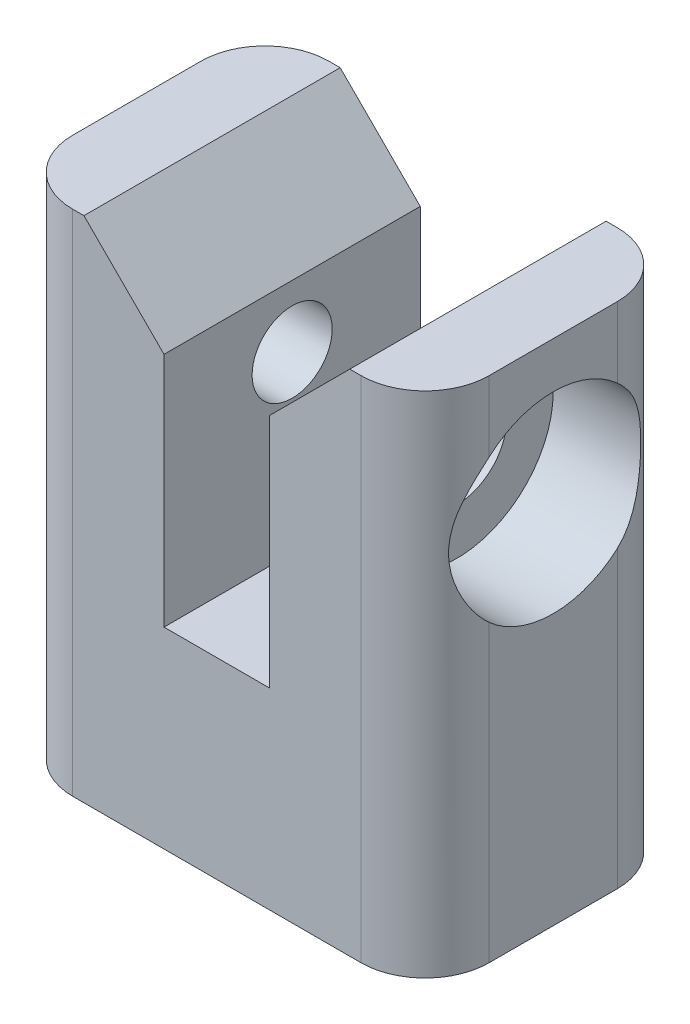
ISO-10303-21;
HEADER;
FILE_DESCRIPTION(('STEP AP214'),'2;1');
FILE_NAME('part.step','',(''),(''),'','','');
FILE_SCHEMA(('AUTOMOTIVE_DESIGN { 1 0 10303 214 1 1 1 1 }'));
ENDSEC;
DATA;
#1=APPLICATION_CONTEXT('core data for automotive mechanical design processes');
#2=APPLICATION_PROTOCOL_DEFINITION('international standard','automotive_design',2000,#1);
#3=PRODUCT_CONTEXT('',#1,'mechanical');
#4=PRODUCT('Part','Part','',(#3));
#5=PRODUCT_RELATED_PRODUCT_CATEGORY('part','',(#4));
#6=PRODUCT_DEFINITION_FORMATION('','',#4);
#7=PRODUCT_DEFINITION_CONTEXT('part definition',#1,'design');
#8=PRODUCT_DEFINITION('design','',#6,#7);
#9=PRODUCT_DEFINITION_SHAPE('','',#8);
#10=(LENGTH_UNIT() NAMED_UNIT(*) SI_UNIT(.MILLI.,.METRE.));
#11=(NAMED_UNIT(*) PLANE_ANGLE_UNIT() SI_UNIT($,.RADIAN.));
#12=(NAMED_UNIT(*) SI_UNIT($,.STERADIAN.) SOLID_ANGLE_UNIT());
#13=UNCERTAINTY_MEASURE_WITH_UNIT(LENGTH_MEASURE(1.E-05),#10,'distance_accuracy_value','');
#14=(GEOMETRIC_REPRESENTATION_CONTEXT(3) GLOBAL_UNCERTAINTY_ASSIGNED_CONTEXT((#13)) GLOBAL_UNIT_ASSIGNED_CONTEXT((#10,
#11,#12)) REPRESENTATION_CONTEXT('',''));
#15=CARTESIAN_POINT('',(0.,0.,0.));
#16=DIRECTION('',(0.,0.,1.));
#17=DIRECTION('',(1.,0.,0.));
#18=AXIS2_PLACEMENT_3D('',#15,#16,#17);
#19=CARTESIAN_POINT('',(6.5,0.,4.));
#20=DIRECTION('',(-1.,0.,0.));
#21=DIRECTION('',(0.,-1.,0.));
#22=AXIS2_PLACEMENT_3D('',#19,#20,#21);
#23=PLANE('',#22);
#24=DIRECTION('',(0.,0.,-1.));
#25=VECTOR('',#24,1.);
#26=CARTESIAN_POINT('',(6.5,15.875,4.));
#27=LINE('',#26,#25);
#28=CARTESIAN_POINT('',(6.5,15.875,2.));
#29=VERTEX_POINT('',#28);
#30=CARTESIAN_POINT('',(6.5,15.875,-2.));
#31=VERTEX_POINT('',#30);
#32=EDGE_CURVE('E240',#29,#31,#27,.T.);
#33=ORIENTED_EDGE('',*,*,#32,.F.);
#34=DIRECTION('',(0.,1.,0.));
#35=VECTOR('',#34,1.);
#36=CARTESIAN_POINT('',(6.5,0.,2.));
#37=LINE('',#36,#35);
#38=CARTESIAN_POINT('',(6.5,13.6735679774998,2.));
#39=VERTEX_POINT('',#38);
#40=EDGE_CURVE('E296',#29,#39,#37,.F.);
#41=ORIENTED_EDGE('',*,*,#40,.T.);
#42=CARTESIAN_POINT('',(6.5,11.4375,0.));
#43=DIRECTION('',(1.,0.,0.));
#44=DIRECTION('',(0.,0.,-1.));
#45=AXIS2_PLACEMENT_3D('',#42,#43,#44);
#46=CIRCLE('',#45,3.);
#47=CARTESIAN_POINT('',(6.5,13.6735679774998,-2.));
#48=VERTEX_POINT('',#47);
#49=EDGE_CURVE('E175',#48,#39,#46,.T.);
#50=ORIENTED_EDGE('',*,*,#49,.F.);
#51=DIRECTION('',(0.,1.,0.));
#52=VECTOR('',#51,1.);
#53=CARTESIAN_POINT('',(6.5,0.,-2.));
#54=LINE('',#53,#52);
#55=EDGE_CURVE('E290',#48,#31,#54,.T.);
#56=ORIENTED_EDGE('',*,*,#55,.T.);
#57=EDGE_LOOP('',(#33,#41,#50,#56));
#58=FACE_BOUND('',#57,.T.);
#59=ADVANCED_FACE('F45',(#58),#23,.F.);
#60=CARTESIAN_POINT('',(1.65,15.875,4.));
#61=DIRECTION('',(1.,0.,0.));
#62=DIRECTION('',(0.,0.,-1.));
#63=AXIS2_PLACEMENT_3D('',#60,#61,#62);
#64=PLANE('',#63);
#65=DIRECTION('',(0.,-1.,0.));
#66=VECTOR('',#65,1.);
#67=CARTESIAN_POINT('',(1.65,15.875,4.));
#68=LINE('',#67,#66);
#69=CARTESIAN_POINT('',(1.65,13.375,4.));
#70=VERTEX_POINT('',#69);
#71=CARTESIAN_POINT('',(1.65,6.,4.));
#72=VERTEX_POINT('',#71);
#73=EDGE_CURVE('E198',#70,#72,#68,.T.);
#74=ORIENTED_EDGE('',*,*,#73,.F.);
#75=DIRECTION('',(0.,0.,-1.));
#76=VECTOR('',#75,1.);
#77=CARTESIAN_POINT('',(1.65,13.375,4.));
#78=LINE('',#77,#76);
#79=CARTESIAN_POINT('',(1.65,13.375,-4.));
#80=VERTEX_POINT('',#79);
#81=EDGE_CURVE('E257',#70,#80,#78,.T.);
#82=ORIENTED_EDGE('',*,*,#81,.T.);
#83=DIRECTION('',(0.,-1.,0.));
#84=VECTOR('',#83,1.);
#85=CARTESIAN_POINT('',(1.65,15.875,-4.));
#86=LINE('',#85,#84);
#87=CARTESIAN_POINT('',(1.65,6.,-4.));
#88=VERTEX_POINT('',#87);
#89=EDGE_CURVE('E214',#80,#88,#86,.T.);
#90=ORIENTED_EDGE('',*,*,#89,.T.);
#91=DIRECTION('',(0.,0.,-1.));
#92=VECTOR('',#91,1.);
#93=CARTESIAN_POINT('',(1.65,6.,4.));
#94=LINE('',#93,#92);
#95=EDGE_CURVE('E237',#72,#88,#94,.T.);
#96=ORIENTED_EDGE('',*,*,#95,.F.);
#97=EDGE_LOOP('',(#74,#82,#90,#96));
#98=FACE_BOUND('',#97,.T.);
#99=CARTESIAN_POINT('',(1.65,11.4375,0.));
#100=DIRECTION('',(1.,0.,0.));
#101=DIRECTION('',(0.,0.,-1.));
#102=AXIS2_PLACEMENT_3D('',#99,#100,#101);
#103=CIRCLE('',#102,1.55);
#104=CARTESIAN_POINT('',(1.65,11.4375,-1.55));
#105=VERTEX_POINT('',#104);
#106=EDGE_CURVE('E180',#105,#105,#103,.F.);
#107=ORIENTED_EDGE('',*,*,#106,.F.);
#108=EDGE_LOOP('',(#107));
#109=FACE_BOUND('',#108,.T.);
#110=ADVANCED_FACE('F356',(#98,#109),#64,.F.);
#111=CARTESIAN_POINT('',(6.5,9.20143202250022,2.));
#112=VERTEX_POINT('',#111);
#113=CARTESIAN_POINT('',(6.5,9.20143202250022,-2.));
#114=VERTEX_POINT('',#113);
#115=EDGE_CURVE('E172',#112,#114,#46,.T.);
#116=ORIENTED_EDGE('',*,*,#115,.F.);
#117=DIRECTION('',(0.,1.,0.));
#118=VECTOR('',#117,1.);
#119=CARTESIAN_POINT('',(6.5,0.,2.));
#120=LINE('',#119,#118);
#121=CARTESIAN_POINT('',(6.5,0.,2.));
#122=VERTEX_POINT('',#121);
#123=EDGE_CURVE('E294',#112,#122,#120,.F.);
#124=ORIENTED_EDGE('',*,*,#123,.T.);
#125=DIRECTION('',(0.,0.,-1.));
#126=VECTOR('',#125,1.);
#127=CARTESIAN_POINT('',(6.5,0.,4.));
#128=LINE('',#127,#126);
#129=CARTESIAN_POINT('',(6.5,0.,-2.));
#130=VERTEX_POINT('',#129);
#131=EDGE_CURVE('E212',#122,#130,#128,.T.);
#132=ORIENTED_EDGE('',*,*,#131,.T.);
#133=DIRECTION('',(0.,1.,0.));
#134=VECTOR('',#133,1.);
#135=CARTESIAN_POINT('',(6.5,0.,-2.));
#136=LINE('',#135,#134);
#137=EDGE_CURVE('E292',#130,#114,#136,.T.);
#138=ORIENTED_EDGE('',*,*,#137,.T.);
#139=EDGE_LOOP('',(#116,#124,#132,#138));
#140=FACE_BOUND('',#139,.T.);
#141=ADVANCED_FACE('F359',(#140),#23,.F.);
#142=CARTESIAN_POINT('',(6.5,15.875,4.));
#143=DIRECTION('',(0.,-1.,0.));
#144=DIRECTION('',(0.,0.,-1.));
#145=AXIS2_PLACEMENT_3D('',#142,#143,#144);
#146=PLANE('',#145);
#147=DIRECTION('',(-1.,0.,0.));
#148=VECTOR('',#147,1.);
#149=CARTESIAN_POINT('',(6.5,15.875,4.));
#150=LINE('',#149,#148);
#151=CARTESIAN_POINT('',(4.5,15.875,4.));
#152=VERTEX_POINT('',#151);
#153=CARTESIAN_POINT('',(4.15000000000001,15.875,4.));
#154=VERTEX_POINT('',#153);
#155=EDGE_CURVE('E196',#152,#154,#150,.T.);
#156=ORIENTED_EDGE('',*,*,#155,.F.);
#157=CARTESIAN_POINT('',(4.5,15.875,2.));
#158=DIRECTION('',(0.,-1.,0.));
#159=DIRECTION('',(0.,0.,-1.));
#160=AXIS2_PLACEMENT_3D('',#157,#158,#159);
#161=CIRCLE('',#160,2.);
#162=EDGE_CURVE('E288',#152,#29,#161,.F.);
#163=ORIENTED_EDGE('',*,*,#162,.T.);
#164=ORIENTED_EDGE('',*,*,#32,.T.);
#165=CARTESIAN_POINT('',(4.5,15.875,-2.));
#166=DIRECTION('',(0.,-1.,0.));
#167=DIRECTION('',(0.,0.,-1.));
#168=AXIS2_PLACEMENT_3D('',#165,#166,#167);
#169=CIRCLE('',#168,2.);
#170=CARTESIAN_POINT('',(4.5,15.875,-4.));
#171=VERTEX_POINT('',#170);
#172=EDGE_CURVE('E286',#31,#171,#169,.F.);
#173=ORIENTED_EDGE('',*,*,#172,.T.);
#174=DIRECTION('',(-1.,0.,0.));
#175=VECTOR('',#174,1.);
#176=CARTESIAN_POINT('',(6.5,15.875,-4.));
#177=LINE('',#176,#175);
#178=CARTESIAN_POINT('',(4.15000000000001,15.875,-4.));
#179=VERTEX_POINT('',#178);
#180=EDGE_CURVE('E195',#171,#179,#177,.T.);
#181=ORIENTED_EDGE('',*,*,#180,.T.);
#182=DIRECTION('',(0.,0.,1.));
#183=VECTOR('',#182,1.);
#184=CARTESIAN_POINT('',(4.15000000000001,15.875,4.));
#185=LINE('',#184,#183);
#186=EDGE_CURVE('E260',#179,#154,#185,.T.);
#187=ORIENTED_EDGE('',*,*,#186,.T.);
#188=EDGE_LOOP('',(#156,#163,#164,#173,#181,#187));
#189=FACE_BOUND('',#188,.T.);
#190=ADVANCED_FACE('F354',(#189),#146,.F.);
#191=CARTESIAN_POINT('',(1.65,6.,4.));
#192=DIRECTION('',(0.,-1.,0.));
#193=DIRECTION('',(0.,0.,-1.));
#194=AXIS2_PLACEMENT_3D('',#191,#192,#193);
#195=PLANE('',#194);
#196=DIRECTION('',(-1.,0.,0.));
#197=VECTOR('',#196,1.);
#198=CARTESIAN_POINT('',(1.65,6.,-4.));
#199=LINE('',#198,#197);
#200=CARTESIAN_POINT('',(-1.65,6.,-4.));
#201=VERTEX_POINT('',#200);
#202=EDGE_CURVE('E216',#88,#201,#199,.T.);
#203=ORIENTED_EDGE('',*,*,#202,.T.);
#204=DIRECTION('',(0.,0.,-1.));
#205=VECTOR('',#204,1.);
#206=CARTESIAN_POINT('',(-1.65,6.,4.));
#207=LINE('',#206,#205);
#208=CARTESIAN_POINT('',(-1.65,6.,4.));
#209=VERTEX_POINT('',#208);
#210=EDGE_CURVE('E234',#209,#201,#207,.T.);
#211=ORIENTED_EDGE('',*,*,#210,.F.);
#212=DIRECTION('',(-1.,0.,0.));
#213=VECTOR('',#212,1.);
#214=CARTESIAN_POINT('',(1.65,6.,4.));
#215=LINE('',#214,#213);
#216=EDGE_CURVE('E201',#72,#209,#215,.T.);
#217=ORIENTED_EDGE('',*,*,#216,.F.);
#218=ORIENTED_EDGE('',*,*,#95,.T.);
#219=EDGE_LOOP('',(#203,#211,#217,#218));
#220=FACE_BOUND('',#219,.T.);
#221=ADVANCED_FACE('F350',(#220),#195,.F.);
#222=CARTESIAN_POINT('',(-1.65,6.,4.));
#223=DIRECTION('',(-1.,0.,0.));
#224=DIRECTION('',(0.,0.,1.));
#225=AXIS2_PLACEMENT_3D('',#222,#223,#224);
#226=PLANE('',#225);
#227=CARTESIAN_POINT('',(-1.65,11.4375,0.));
#228=DIRECTION('',(-1.,0.,0.));
#229=DIRECTION('',(0.,0.,1.));
#230=AXIS2_PLACEMENT_3D('',#227,#228,#229);
#231=CIRCLE('',#230,1.25);
#232=CARTESIAN_POINT('',(-1.65,11.4375,1.25));
#233=VERTEX_POINT('',#232);
#234=EDGE_CURVE('E192',#233,#233,#231,.T.);
#235=ORIENTED_EDGE('',*,*,#234,.T.);
#236=EDGE_LOOP('',(#235));
#237=FACE_BOUND('',#236,.T.);
#238=DIRECTION('',(0.,1.,0.));
#239=VECTOR('',#238,1.);
#240=CARTESIAN_POINT('',(-1.65,6.,-4.));
#241=LINE('',#240,#239);
#242=CARTESIAN_POINT('',(-1.65,13.375,-4.));
#243=VERTEX_POINT('',#242);
#244=EDGE_CURVE('E218',#201,#243,#241,.T.);
#245=ORIENTED_EDGE('',*,*,#244,.T.);
#246=DIRECTION('',(0.,0.,1.));
#247=VECTOR('',#246,1.);
#248=CARTESIAN_POINT('',(-1.65,13.375,4.));
#249=LINE('',#248,#247);
#250=CARTESIAN_POINT('',(-1.65,13.375,4.));
#251=VERTEX_POINT('',#250);
#252=EDGE_CURVE('E251',#243,#251,#249,.T.);
#253=ORIENTED_EDGE('',*,*,#252,.T.);
#254=DIRECTION('',(0.,1.,0.));
#255=VECTOR('',#254,1.);
#256=CARTESIAN_POINT('',(-1.65,6.,4.));
#257=LINE('',#256,#255);
#258=EDGE_CURVE('E203',#209,#251,#257,.T.);
#259=ORIENTED_EDGE('',*,*,#258,.F.);
#260=ORIENTED_EDGE('',*,*,#210,.T.);
#261=EDGE_LOOP('',(#245,#253,#259,#260));
#262=FACE_BOUND('',#261,.T.);
#263=ADVANCED_FACE('F346',(#237,#262),#226,.F.);
#264=CARTESIAN_POINT('',(-1.65,15.875,4.));
#265=DIRECTION('',(0.,-1.,0.));
#266=DIRECTION('',(0.,0.,-1.));
#267=AXIS2_PLACEMENT_3D('',#264,#265,#266);
#268=PLANE('',#267);
#269=DIRECTION('',(0.,0.,-1.));
#270=VECTOR('',#269,1.);
#271=CARTESIAN_POINT('',(-6.5,15.875,4.));
#272=LINE('',#271,#270);
#273=CARTESIAN_POINT('',(-6.5,15.875,2.));
#274=VERTEX_POINT('',#273);
#275=CARTESIAN_POINT('',(-6.5,15.875,-2.));
#276=VERTEX_POINT('',#275);
#277=EDGE_CURVE('E231',#274,#276,#272,.T.);
#278=ORIENTED_EDGE('',*,*,#277,.F.);
#279=CARTESIAN_POINT('',(-4.5,15.875,2.));
#280=DIRECTION('',(0.,-1.,0.));
#281=DIRECTION('',(0.,0.,-1.));
#282=AXIS2_PLACEMENT_3D('',#279,#280,#281);
#283=CIRCLE('',#282,2.);
#284=CARTESIAN_POINT('',(-4.5,15.875,4.));
#285=VERTEX_POINT('',#284);
#286=EDGE_CURVE('E284',#274,#285,#283,.F.);
#287=ORIENTED_EDGE('',*,*,#286,.T.);
#288=DIRECTION('',(-1.,0.,0.));
#289=VECTOR('',#288,1.);
#290=CARTESIAN_POINT('',(-1.65,15.875,4.));
#291=LINE('',#290,#289);
#292=CARTESIAN_POINT('',(-4.15,15.875,4.));
#293=VERTEX_POINT('',#292);
#294=EDGE_CURVE('E206',#293,#285,#291,.T.);
#295=ORIENTED_EDGE('',*,*,#294,.F.);
#296=DIRECTION('',(0.,0.,-1.));
#297=VECTOR('',#296,1.);
#298=CARTESIAN_POINT('',(-4.15,15.875,4.));
#299=LINE('',#298,#297);
#300=CARTESIAN_POINT('',(-4.15,15.875,-4.));
#301=VERTEX_POINT('',#300);
#302=EDGE_CURVE('E243',#293,#301,#299,.T.);
#303=ORIENTED_EDGE('',*,*,#302,.T.);
#304=DIRECTION('',(-1.,0.,0.));
#305=VECTOR('',#304,1.);
#306=CARTESIAN_POINT('',(-1.65,15.875,-4.));
#307=LINE('',#306,#305);
#308=CARTESIAN_POINT('',(-4.5,15.875,-4.));
#309=VERTEX_POINT('',#308);
#310=EDGE_CURVE('E221',#301,#309,#307,.T.);
#311=ORIENTED_EDGE('',*,*,#310,.T.);
#312=CARTESIAN_POINT('',(-4.5,15.875,-2.));
#313=DIRECTION('',(0.,-1.,0.));
#314=DIRECTION('',(0.,0.,-1.));
#315=AXIS2_PLACEMENT_3D('',#312,#313,#314);
#316=CIRCLE('',#315,2.);
#317=EDGE_CURVE('E282',#309,#276,#316,.F.);
#318=ORIENTED_EDGE('',*,*,#317,.T.);
#319=EDGE_LOOP('',(#278,#287,#295,#303,#311,#318));
#320=FACE_BOUND('',#319,.T.);
#321=ADVANCED_FACE('F342',(#320),#268,.F.);
#322=CARTESIAN_POINT('',(-6.5,15.875,4.));
#323=DIRECTION('',(1.,0.,0.));
#324=DIRECTION('',(0.,1.,0.));
#325=AXIS2_PLACEMENT_3D('',#322,#323,#324);
#326=PLANE('',#325);
#327=CARTESIAN_POINT('',(-6.5,11.4375,0.));
#328=DIRECTION('',(1.,0.,0.));
#329=DIRECTION('',(0.,0.,-1.));
#330=AXIS2_PLACEMENT_3D('',#327,#328,#329);
#331=CIRCLE('',#330,1.25);
#332=CARTESIAN_POINT('',(-6.5,11.4375,-1.25));
#333=VERTEX_POINT('',#332);
#334=EDGE_CURVE('E182',#333,#333,#331,.T.);
#335=ORIENTED_EDGE('',*,*,#334,.T.);
#336=EDGE_LOOP('',(#335));
#337=FACE_BOUND('',#336,.T.);
#338=DIRECTION('',(0.,0.,-1.));
#339=VECTOR('',#338,1.);
#340=CARTESIAN_POINT('',(-6.5,0.,4.));
#341=LINE('',#340,#339);
#342=CARTESIAN_POINT('',(-6.5,0.,2.));
#343=VERTEX_POINT('',#342);
#344=CARTESIAN_POINT('',(-6.5,0.,-2.));
#345=VERTEX_POINT('',#344);
#346=EDGE_CURVE('E228',#343,#345,#341,.T.);
#347=ORIENTED_EDGE('',*,*,#346,.F.);
#348=DIRECTION('',(0.,-1.,0.));
#349=VECTOR('',#348,1.);
#350=CARTESIAN_POINT('',(-6.5,15.875,2.));
#351=LINE('',#350,#349);
#352=EDGE_CURVE('E280',#343,#274,#351,.F.);
#353=ORIENTED_EDGE('',*,*,#352,.T.);
#354=ORIENTED_EDGE('',*,*,#277,.T.);
#355=DIRECTION('',(0.,-1.,0.));
#356=VECTOR('',#355,1.);
#357=CARTESIAN_POINT('',(-6.5,15.875,-2.));
#358=LINE('',#357,#356);
#359=EDGE_CURVE('E277',#276,#345,#358,.T.);
#360=ORIENTED_EDGE('',*,*,#359,.T.);
#361=EDGE_LOOP('',(#347,#353,#354,#360));
#362=FACE_BOUND('',#361,.T.);
#363=ADVANCED_FACE('F338',(#337,#362),#326,.F.);
#364=CARTESIAN_POINT('',(-6.5,0.,4.));
#365=DIRECTION('',(0.,1.,0.));
#366=DIRECTION('',(0.,0.,1.));
#367=AXIS2_PLACEMENT_3D('',#364,#365,#366);
#368=PLANE('',#367);
#369=CARTESIAN_POINT('',(0.,0.,0.));
#370=DIRECTION('',(0.,-1.,0.));
#371=DIRECTION('',(0.,0.,-1.));
#372=AXIS2_PLACEMENT_3D('',#369,#370,#371);
#373=CIRCLE('',#372,1.24999999999999);
#374=CARTESIAN_POINT('',(0.,0.,-1.24999999999999));
#375=VERTEX_POINT('',#374);
#376=EDGE_CURVE('E173',#375,#375,#373,.T.);
#377=ORIENTED_EDGE('',*,*,#376,.F.);
#378=EDGE_LOOP('',(#377));
#379=FACE_BOUND('',#378,.T.);
#380=DIRECTION('',(1.,0.,0.));
#381=VECTOR('',#380,1.);
#382=CARTESIAN_POINT('',(-6.5,0.,4.));
#383=LINE('',#382,#381);
#384=CARTESIAN_POINT('',(-4.5,0.,4.));
#385=VERTEX_POINT('',#384);
#386=CARTESIAN_POINT('',(4.5,0.,4.));
#387=VERTEX_POINT('',#386);
#388=EDGE_CURVE('E209',#385,#387,#383,.T.);
#389=ORIENTED_EDGE('',*,*,#388,.F.);
#390=CARTESIAN_POINT('',(-4.5,0.,2.));
#391=DIRECTION('',(0.,1.,0.));
#392=DIRECTION('',(0.,0.,1.));
#393=AXIS2_PLACEMENT_3D('',#390,#391,#392);
#394=CIRCLE('',#393,2.);
#395=EDGE_CURVE('E275',#385,#343,#394,.F.);
#396=ORIENTED_EDGE('',*,*,#395,.T.);
#397=ORIENTED_EDGE('',*,*,#346,.T.);
#398=CARTESIAN_POINT('',(-4.5,0.,-2.));
#399=DIRECTION('',(0.,1.,0.));
#400=DIRECTION('',(0.,0.,1.));
#401=AXIS2_PLACEMENT_3D('',#398,#399,#400);
#402=CIRCLE('',#401,2.);
#403=CARTESIAN_POINT('',(-4.5,0.,-4.));
#404=VERTEX_POINT('',#403);
#405=EDGE_CURVE('E271',#345,#404,#402,.F.);
#406=ORIENTED_EDGE('',*,*,#405,.T.);
#407=DIRECTION('',(1.,0.,0.));
#408=VECTOR('',#407,1.);
#409=CARTESIAN_POINT('',(-6.5,0.,-4.));
#410=LINE('',#409,#408);
#411=CARTESIAN_POINT('',(4.5,0.,-4.));
#412=VERTEX_POINT('',#411);
#413=EDGE_CURVE('E199',#404,#412,#410,.T.);
#414=ORIENTED_EDGE('',*,*,#413,.T.);
#415=CARTESIAN_POINT('',(4.5,0.,-2.));
#416=DIRECTION('',(0.,1.,0.));
#417=DIRECTION('',(0.,0.,1.));
#418=AXIS2_PLACEMENT_3D('',#415,#416,#417);
#419=CIRCLE('',#418,2.);
#420=EDGE_CURVE('E269',#412,#130,#419,.F.);
#421=ORIENTED_EDGE('',*,*,#420,.T.);
#422=ORIENTED_EDGE('',*,*,#131,.F.);
#423=CARTESIAN_POINT('',(4.5,0.,2.));
#424=DIRECTION('',(0.,1.,0.));
#425=DIRECTION('',(0.,0.,1.));
#426=AXIS2_PLACEMENT_3D('',#423,#424,#425);
#427=CIRCLE('',#426,2.);
#428=EDGE_CURVE('E273',#122,#387,#427,.F.);
#429=ORIENTED_EDGE('',*,*,#428,.T.);
#430=EDGE_LOOP('',(#389,#396,#397,#406,#414,#421,#422,#429));
#431=FACE_BOUND('',#430,.T.);
#432=ADVANCED_FACE('F331',(#379,#431),#368,.F.);
#433=CARTESIAN_POINT('',(0.,0.,4.));
#434=DIRECTION('',(0.,0.,1.));
#435=DIRECTION('',(1.,0.,0.));
#436=AXIS2_PLACEMENT_3D('',#433,#434,#435);
#437=PLANE('',#436);
#438=ORIENTED_EDGE('',*,*,#294,.T.);
#439=DIRECTION('',(0.,-1.,0.));
#440=VECTOR('',#439,1.);
#441=CARTESIAN_POINT('',(-4.5,0.,4.));
#442=LINE('',#441,#440);
#443=EDGE_CURVE('E266',#285,#385,#442,.T.);
#444=ORIENTED_EDGE('',*,*,#443,.T.);
#445=ORIENTED_EDGE('',*,*,#388,.T.);
#446=DIRECTION('',(0.,1.,0.));
#447=VECTOR('',#446,1.);
#448=CARTESIAN_POINT('',(4.5,15.875,4.));
#449=LINE('',#448,#447);
#450=EDGE_CURVE('E263',#387,#152,#449,.T.);
#451=ORIENTED_EDGE('',*,*,#450,.T.);
#452=ORIENTED_EDGE('',*,*,#155,.T.);
#453=DIRECTION('',(0.707106781186549,0.707106781186546,0.));
#454=VECTOR('',#453,1.);
#455=CARTESIAN_POINT('',(-5.86250000000001,5.86250000000004,4.));
#456=LINE('',#455,#454);
#457=EDGE_CURVE('E253',#154,#70,#456,.F.);
#458=ORIENTED_EDGE('',*,*,#457,.T.);
#459=ORIENTED_EDGE('',*,*,#73,.T.);
#460=ORIENTED_EDGE('',*,*,#216,.T.);
#461=ORIENTED_EDGE('',*,*,#258,.T.);
#462=DIRECTION('',(0.707106781186546,-0.707106781186549,0.));
#463=VECTOR('',#462,1.);
#464=CARTESIAN_POINT('',(5.86249999999999,5.86249999999997,4.));
#465=LINE('',#464,#463);
#466=EDGE_CURVE('E255',#251,#293,#465,.F.);
#467=ORIENTED_EDGE('',*,*,#466,.T.);
#468=EDGE_LOOP('',(#438,#444,#445,#451,#452,#458,#459,#460,#461,#467));
#469=FACE_BOUND('',#468,.T.);
#470=ADVANCED_FACE('F328',(#469),#437,.T.);
#471=CARTESIAN_POINT('',(0.,0.,-4.));
#472=DIRECTION('',(0.,0.,1.));
#473=DIRECTION('',(1.,0.,0.));
#474=AXIS2_PLACEMENT_3D('',#471,#472,#473);
#475=PLANE('',#474);
#476=ORIENTED_EDGE('',*,*,#413,.F.);
#477=DIRECTION('',(0.,-1.,0.));
#478=VECTOR('',#477,1.);
#479=CARTESIAN_POINT('',(-4.5,0.,-4.));
#480=LINE('',#479,#478);
#481=EDGE_CURVE('E11',#404,#309,#480,.F.);
#482=ORIENTED_EDGE('',*,*,#481,.T.);
#483=ORIENTED_EDGE('',*,*,#310,.F.);
#484=DIRECTION('',(-0.707106781186546,0.707106781186549,0.));
#485=VECTOR('',#484,1.);
#486=CARTESIAN_POINT('',(-4.15,15.875,-4.));
#487=LINE('',#486,#485);
#488=EDGE_CURVE('E249',#301,#243,#487,.F.);
#489=ORIENTED_EDGE('',*,*,#488,.T.);
#490=ORIENTED_EDGE('',*,*,#244,.F.);
#491=ORIENTED_EDGE('',*,*,#202,.F.);
#492=ORIENTED_EDGE('',*,*,#89,.F.);
#493=DIRECTION('',(-0.707106781186549,-0.707106781186546,0.));
#494=VECTOR('',#493,1.);
#495=CARTESIAN_POINT('',(1.65,13.375,-4.));
#496=LINE('',#495,#494);
#497=EDGE_CURVE('E246',#80,#179,#496,.F.);
#498=ORIENTED_EDGE('',*,*,#497,.T.);
#499=ORIENTED_EDGE('',*,*,#180,.F.);
#500=DIRECTION('',(0.,1.,0.));
#501=VECTOR('',#500,1.);
#502=CARTESIAN_POINT('',(4.5,0.,-4.));
#503=LINE('',#502,#501);
#504=EDGE_CURVE('E54',#171,#412,#503,.F.);
#505=ORIENTED_EDGE('',*,*,#504,.T.);
#506=EDGE_LOOP('',(#476,#482,#483,#489,#490,#491,#492,#498,#499,#505));
#507=FACE_BOUND('',#506,.T.);
#508=ADVANCED_FACE('F326',(#507),#475,.F.);
#509=CARTESIAN_POINT('',(6.5,11.4375,0.));
#510=DIRECTION('',(1.,0.,0.));
#511=DIRECTION('',(0.,0.,-1.));
#512=AXIS2_PLACEMENT_3D('',#509,#510,#511);
#513=CYLINDRICAL_SURFACE('',#512,1.25);
#514=ORIENTED_EDGE('',*,*,#334,.F.);
#515=EDGE_LOOP('',(#514));
#516=FACE_BOUND('',#515,.T.);
#517=ORIENTED_EDGE('',*,*,#234,.F.);
#518=EDGE_LOOP('',(#517));
#519=FACE_BOUND('',#518,.T.);
#520=ADVANCED_FACE('F322',(#516,#519),#513,.F.);
#521=CARTESIAN_POINT('',(6.5,11.4375,0.));
#522=DIRECTION('',(1.,0.,0.));
#523=DIRECTION('',(0.,0.,-1.));
#524=AXIS2_PLACEMENT_3D('',#521,#522,#523);
#525=CYLINDRICAL_SURFACE('',#524,1.55);
#526=ORIENTED_EDGE('',*,*,#106,.T.);
#527=EDGE_LOOP('',(#526));
#528=FACE_BOUND('',#527,.T.);
#529=CARTESIAN_POINT('',(3.5,11.4375,0.));
#530=DIRECTION('',(1.,0.,0.));
#531=DIRECTION('',(0.,0.,-1.));
#532=AXIS2_PLACEMENT_3D('',#529,#530,#531);
#533=CIRCLE('',#532,1.55);
#534=CARTESIAN_POINT('',(3.5,11.4375,-1.55));
#535=VERTEX_POINT('',#534);
#536=EDGE_CURVE('E183',#535,#535,#533,.T.);
#537=ORIENTED_EDGE('',*,*,#536,.T.);
#538=EDGE_LOOP('',(#537));
#539=FACE_BOUND('',#538,.T.);
#540=ADVANCED_FACE('F318',(#528,#539),#525,.F.);
#541=CARTESIAN_POINT('',(3.5,12.9875,0.));
#542=DIRECTION('',(-1.,0.,0.));
#543=DIRECTION('',(0.,0.,1.));
#544=AXIS2_PLACEMENT_3D('',#541,#542,#543);
#545=PLANE('',#544);
#546=ORIENTED_EDGE('',*,*,#536,.F.);
#547=EDGE_LOOP('',(#546));
#548=FACE_BOUND('',#547,.T.);
#549=CARTESIAN_POINT('',(3.5,11.4375,0.));
#550=DIRECTION('',(1.,0.,0.));
#551=DIRECTION('',(0.,0.,-1.));
#552=AXIS2_PLACEMENT_3D('',#549,#550,#551);
#553=CIRCLE('',#552,3.);
#554=CARTESIAN_POINT('',(3.5,11.4375,-3.));
#555=VERTEX_POINT('',#554);
#556=EDGE_CURVE('E185',#555,#555,#553,.T.);
#557=ORIENTED_EDGE('',*,*,#556,.T.);
#558=EDGE_LOOP('',(#557));
#559=FACE_BOUND('',#558,.T.);
#560=ADVANCED_FACE('F312',(#548,#559),#545,.F.);
#561=CARTESIAN_POINT('',(6.5,11.4375,0.));
#562=DIRECTION('',(1.,0.,0.));
#563=DIRECTION('',(0.,0.,-1.));
#564=AXIS2_PLACEMENT_3D('',#561,#562,#563);
#565=CYLINDRICAL_SURFACE('',#564,3.);
#566=ORIENTED_EDGE('',*,*,#556,.F.);
#567=EDGE_LOOP('',(#566));
#568=FACE_BOUND('',#567,.T.);
#569=ORIENTED_EDGE('',*,*,#49,.T.);
#570=CARTESIAN_POINT('',(6.5,13.6735679774998,2.));
#571=CARTESIAN_POINT('',(6.499991001011,13.6163855478033,2.06394517691885));
#572=CARTESIAN_POINT('',(6.4969360380857,13.5565364412217,2.12532528051229));
#573=CARTESIAN_POINT('',(6.48611898621429,13.4321447310036,2.24246904553587));
#574=CARTESIAN_POINT('',(6.47836508123115,13.3676104589545,2.298242275777));
#575=CARTESIAN_POINT('',(6.45017234272973,13.168096745179,2.45637007661865));
#576=CARTESIAN_POINT('',(6.42478284473025,13.0267936596859,2.54999094611882));
#577=CARTESIAN_POINT('',(6.37374363556637,12.7466499131143,2.70351409692412));
#578=CARTESIAN_POINT('',(6.34839702859367,12.6090884407773,2.76591417176496));
#579=CARTESIAN_POINT('',(6.30196858335304,12.3253388832018,2.86957685432165));
#580=CARTESIAN_POINT('',(6.28088654858421,12.1791511958391,2.91084043608888));
#581=CARTESIAN_POINT('',(6.25596949240038,11.9474243254817,2.95755558506507));
#582=CARTESIAN_POINT('',(6.248632542817,11.8637627857724,2.97077330715622));
#583=CARTESIAN_POINT('',(6.23776717812591,11.6953505861091,2.99009818067826));
#584=CARTESIAN_POINT('',(6.23423875917959,11.6105999272529,2.99620533927588));
#585=CARTESIAN_POINT('',(6.23136049723198,11.4408883025956,3.0011984244539));
#586=CARTESIAN_POINT('',(6.2320071885158,11.355927569728,3.00009034032449));
#587=CARTESIAN_POINT('',(6.23740229886055,11.1865417977142,2.99068785441197));
#588=CARTESIAN_POINT('',(6.24215049675273,11.1021167299303,2.9823938401213));
#589=CARTESIAN_POINT('',(6.25444574206346,10.9450915727392,2.96023799477242));
#590=CARTESIAN_POINT('',(6.26156617601762,10.8723385096925,2.94720665500375));
#591=CARTESIAN_POINT('',(6.27805254568629,10.7282237627781,2.91588199177903));
#592=CARTESIAN_POINT('',(6.28741918087212,10.6568625198259,2.89758702886555));
#593=CARTESIAN_POINT('',(6.31797183442906,10.445187514645,2.83495868687428));
#594=CARTESIAN_POINT('',(6.34159414686495,10.3074578758696,2.78290698794504));
#595=CARTESIAN_POINT('',(6.39191744429795,10.0269645681969,2.65268930185857));
#596=CARTESIAN_POINT('',(6.41867912533449,9.88521761274556,2.57233831358789));
#597=CARTESIAN_POINT('',(6.45266518339439,9.68339217182401,2.43509943111144));
#598=CARTESIAN_POINT('',(6.46295878825199,9.61799094310306,2.38663843700204));
#599=CARTESIAN_POINT('',(6.48036336932118,9.49111311300452,2.2843387371315));
#600=CARTESIAN_POINT('',(6.48747705373093,9.42963321041528,2.23050465538148));
#601=CARTESIAN_POINT('',(6.49483575714756,9.34109484225228,2.1463272041771));
#602=CARTESIAN_POINT('',(6.49673503153455,9.31235428526319,2.11787440473897));
#603=CARTESIAN_POINT('',(6.4993170113589,9.25601833199297,2.05979965940774));
#604=CARTESIAN_POINT('',(6.49999960377178,9.22842304233476,2.03017760515717));
#605=CARTESIAN_POINT('',(6.5,9.20143202250021,2.));
#606=B_SPLINE_CURVE_WITH_KNOTS('',3,(#570,#571,#572,#573,#574,#575,#576,#577,#578,#579,#580,
#581,#582,#583,#584,#585,#586,#587,#588,#589,#590,#591,#592,#593,#594,#595,#596,#597,#598,#599,
#600,#601,#602,#603,#604,#605),.UNSPECIFIED.,.F.,.F.,(4,2,2,2,2,2,2,2,2,2,2,2,2,2,2,2,2,4),(0.,
0.257003095036121,0.513559859167406,1.02485284203966,1.4828396357824,1.94080532182222,
2.19552218723163,2.45023879591204,2.70474399422835,2.95923546951888,3.18175175856396,
3.40433742978967,3.85003679324152,4.34303172260549,4.58891756679052,4.83459359999334,
4.95600984354938,5.07743736555963),.UNSPECIFIED.);
#607=EDGE_CURVE('E69',#39,#112,#606,.T.);
#608=ORIENTED_EDGE('',*,*,#607,.T.);
#609=ORIENTED_EDGE('',*,*,#115,.T.);
#610=CARTESIAN_POINT('',(6.5,9.20143202250022,-2.));
#611=CARTESIAN_POINT('',(6.499991001011,9.25861445219666,-2.06394517691885));
#612=CARTESIAN_POINT('',(6.4969360380857,9.31846355877826,-2.12532528051229));
#613=CARTESIAN_POINT('',(6.48611898621429,9.44285526899635,-2.24246904553587));
#614=CARTESIAN_POINT('',(6.47836508123115,9.50738954104551,-2.298242275777));
#615=CARTESIAN_POINT('',(6.45017234272973,9.70690325482101,-2.45637007661865));
#616=CARTESIAN_POINT('',(6.42478284473025,9.84820634031407,-2.54999094611882));
#617=CARTESIAN_POINT('',(6.37374363556637,10.1283500868857,-2.70351409692412));
#618=CARTESIAN_POINT('',(6.34839702859367,10.2659115592227,-2.76591417176496));
#619=CARTESIAN_POINT('',(6.30196858335304,10.5496611167982,-2.86957685432165));
#620=CARTESIAN_POINT('',(6.28088654858421,10.6958488041609,-2.91084043608888));
#621=CARTESIAN_POINT('',(6.25596949240038,10.9275756745183,-2.95755558506507));
#622=CARTESIAN_POINT('',(6.248632542817,11.0112372142276,-2.97077330715622));
#623=CARTESIAN_POINT('',(6.23776717812591,11.1796494138909,-2.99009818067826));
#624=CARTESIAN_POINT('',(6.23423875917959,11.2644000727471,-2.99620533927588));
#625=CARTESIAN_POINT('',(6.23136049723198,11.4341116974044,-3.0011984244539));
#626=CARTESIAN_POINT('',(6.2320071885158,11.519072430272,-3.00009034032449));
#627=CARTESIAN_POINT('',(6.23740229886055,11.6884582022858,-2.99068785441197));
#628=CARTESIAN_POINT('',(6.24215049675273,11.7728832700697,-2.9823938401213));
#629=CARTESIAN_POINT('',(6.25444574206346,11.9299084272608,-2.96023799477242));
#630=CARTESIAN_POINT('',(6.26156617601762,12.0026614903075,-2.94720665500375));
#631=CARTESIAN_POINT('',(6.27805254568629,12.1467762372219,-2.91588199177903));
#632=CARTESIAN_POINT('',(6.28741918087213,12.2181374801741,-2.89758702886555));
#633=CARTESIAN_POINT('',(6.31797183442906,12.429812485355,-2.83495868687428));
#634=CARTESIAN_POINT('',(6.34159414686495,12.5675421241304,-2.78290698794504));
#635=CARTESIAN_POINT('',(6.39191744429795,12.8480354318031,-2.65268930185857));
#636=CARTESIAN_POINT('',(6.41867912533449,12.9897823872544,-2.57233831358789));
#637=CARTESIAN_POINT('',(6.45266518339439,13.191607828176,-2.43509943111144));
#638=CARTESIAN_POINT('',(6.46295878825199,13.2570090568969,-2.38663843700204));
#639=CARTESIAN_POINT('',(6.48036336932118,13.3838868869955,-2.2843387371315));
#640=CARTESIAN_POINT('',(6.48747705373093,13.4453667895847,-2.23050465538148));
#641=CARTESIAN_POINT('',(6.49483575714756,13.5339051577477,-2.1463272041771));
#642=CARTESIAN_POINT('',(6.49673503153455,13.5626457147368,-2.11787440473897));
#643=CARTESIAN_POINT('',(6.4993170113589,13.618981668007,-2.05979965940774));
#644=CARTESIAN_POINT('',(6.49999960377178,13.6465769576652,-2.03017760515717));
#645=CARTESIAN_POINT('',(6.5,13.6735679774998,-2.));
#646=B_SPLINE_CURVE_WITH_KNOTS('',3,(#610,#611,#612,#613,#614,#615,#616,#617,#618,#619,#620,
#621,#622,#623,#624,#625,#626,#627,#628,#629,#630,#631,#632,#633,#634,#635,#636,#637,#638,#639,
#640,#641,#642,#643,#644,#645),.UNSPECIFIED.,.F.,.F.,(4,2,2,2,2,2,2,2,2,2,2,2,2,2,2,2,2,4),(0.,
0.257003095036121,0.513559859167406,1.02485284203966,1.4828396357824,1.94080532182222,
2.19552218723163,2.45023879591205,2.70474399422835,2.95923546951889,3.18175175856396,
3.40433742978967,3.85003679324152,4.34303172260549,4.58891756679051,4.83459359999334,
4.95600984354938,5.07743736555963),.UNSPECIFIED.);
#647=EDGE_CURVE('E61',#114,#48,#646,.T.);
#648=ORIENTED_EDGE('',*,*,#647,.T.);
#649=EDGE_LOOP('',(#569,#608,#609,#648));
#650=FACE_BOUND('',#649,.T.);
#651=ADVANCED_FACE('F166',(#568,#650),#565,.F.);
#652=CARTESIAN_POINT('',(0.,5.,0.));
#653=DIRECTION('',(0.,-1.,0.));
#654=DIRECTION('',(0.,0.,-1.));
#655=AXIS2_PLACEMENT_3D('',#652,#653,#654);
#656=CONICAL_SURFACE('',#655,1.25,1.02974425867665);
#657=CARTESIAN_POINT('',(0.,5.75107577378445,0.));
#658=VERTEX_POINT('',#657);
#659=VERTEX_LOOP('',#658);
#660=FACE_BOUND('',#659,.T.);
#661=CARTESIAN_POINT('',(0.,5.,0.));
#662=DIRECTION('',(0.,-1.,0.));
#663=DIRECTION('',(0.,0.,-1.));
#664=AXIS2_PLACEMENT_3D('',#661,#662,#663);
#665=CIRCLE('',#664,1.25);
#666=CARTESIAN_POINT('',(0.,5.,-1.25));
#667=VERTEX_POINT('',#666);
#668=EDGE_CURVE('E170',#667,#667,#665,.T.);
#669=ORIENTED_EDGE('',*,*,#668,.T.);
#670=EDGE_LOOP('',(#669));
#671=FACE_BOUND('',#670,.T.);
#672=ADVANCED_FACE('F162',(#660,#671),#656,.F.);
#673=CARTESIAN_POINT('',(0.,0.,0.));
#674=DIRECTION('',(0.,-1.,0.));
#675=DIRECTION('',(0.,0.,-1.));
#676=AXIS2_PLACEMENT_3D('',#673,#674,#675);
#677=CYLINDRICAL_SURFACE('',#676,1.24999999999999);
#678=ORIENTED_EDGE('',*,*,#668,.F.);
#679=EDGE_LOOP('',(#678));
#680=FACE_BOUND('',#679,.T.);
#681=ORIENTED_EDGE('',*,*,#376,.T.);
#682=EDGE_LOOP('',(#681));
#683=FACE_BOUND('',#682,.T.);
#684=ADVANCED_FACE('F165',(#680,#683),#677,.F.);
#685=CARTESIAN_POINT('',(-4.15,15.875,4.));
#686=DIRECTION('',(-0.707106781186549,-0.707106781186546,0.));
#687=DIRECTION('',(0.,0.,-1.));
#688=AXIS2_PLACEMENT_3D('',#685,#686,#687);
#689=PLANE('',#688);
#690=ORIENTED_EDGE('',*,*,#466,.F.);
#691=ORIENTED_EDGE('',*,*,#252,.F.);
#692=ORIENTED_EDGE('',*,*,#488,.F.);
#693=ORIENTED_EDGE('',*,*,#302,.F.);
#694=EDGE_LOOP('',(#690,#691,#692,#693));
#695=FACE_BOUND('',#694,.T.);
#696=ADVANCED_FACE('F368',(#695),#689,.F.);
#697=CARTESIAN_POINT('',(1.65,13.375,4.));
#698=DIRECTION('',(0.707106781186546,-0.707106781186549,0.));
#699=DIRECTION('',(0.,0.,-1.));
#700=AXIS2_PLACEMENT_3D('',#697,#698,#699);
#701=PLANE('',#700);
#702=ORIENTED_EDGE('',*,*,#457,.F.);
#703=ORIENTED_EDGE('',*,*,#186,.F.);
#704=ORIENTED_EDGE('',*,*,#497,.F.);
#705=ORIENTED_EDGE('',*,*,#81,.F.);
#706=EDGE_LOOP('',(#702,#703,#704,#705));
#707=FACE_BOUND('',#706,.T.);
#708=ADVANCED_FACE('F374',(#707),#701,.F.);
#709=CARTESIAN_POINT('',(-4.5,0.,2.));
#710=DIRECTION('',(0.,1.,0.));
#711=DIRECTION('',(-1.,0.,0.));
#712=AXIS2_PLACEMENT_3D('',#709,#710,#711);
#713=CYLINDRICAL_SURFACE('',#712,2.);
#714=ORIENTED_EDGE('',*,*,#286,.F.);
#715=ORIENTED_EDGE('',*,*,#352,.F.);
#716=ORIENTED_EDGE('',*,*,#395,.F.);
#717=ORIENTED_EDGE('',*,*,#443,.F.);
#718=EDGE_LOOP('',(#714,#715,#716,#717));
#719=FACE_BOUND('',#718,.T.);
#720=ADVANCED_FACE('F380',(#719),#713,.T.);
#721=CARTESIAN_POINT('',(4.5,0.,2.));
#722=DIRECTION('',(0.,-1.,0.));
#723=DIRECTION('',(1.,0.,0.));
#724=AXIS2_PLACEMENT_3D('',#721,#722,#723);
#725=CYLINDRICAL_SURFACE('',#724,2.);
#726=ORIENTED_EDGE('',*,*,#607,.F.);
#727=ORIENTED_EDGE('',*,*,#40,.F.);
#728=ORIENTED_EDGE('',*,*,#162,.F.);
#729=ORIENTED_EDGE('',*,*,#450,.F.);
#730=ORIENTED_EDGE('',*,*,#428,.F.);
#731=ORIENTED_EDGE('',*,*,#123,.F.);
#732=EDGE_LOOP('',(#726,#727,#728,#729,#730,#731));
#733=FACE_BOUND('',#732,.T.);
#734=ADVANCED_FACE('F383',(#733),#725,.T.);
#735=CARTESIAN_POINT('',(-4.5,15.875,-2.));
#736=DIRECTION('',(0.,-1.,0.));
#737=DIRECTION('',(1.,0.,0.));
#738=AXIS2_PLACEMENT_3D('',#735,#736,#737);
#739=CYLINDRICAL_SURFACE('',#738,2.);
#740=ORIENTED_EDGE('',*,*,#317,.F.);
#741=ORIENTED_EDGE('',*,*,#481,.F.);
#742=ORIENTED_EDGE('',*,*,#405,.F.);
#743=ORIENTED_EDGE('',*,*,#359,.F.);
#744=EDGE_LOOP('',(#740,#741,#742,#743));
#745=FACE_BOUND('',#744,.T.);
#746=ADVANCED_FACE('F387',(#745),#739,.T.);
#747=CARTESIAN_POINT('',(4.5,0.,-2.));
#748=DIRECTION('',(0.,1.,0.));
#749=DIRECTION('',(-1.,0.,0.));
#750=AXIS2_PLACEMENT_3D('',#747,#748,#749);
#751=CYLINDRICAL_SURFACE('',#750,2.);
#752=ORIENTED_EDGE('',*,*,#420,.F.);
#753=ORIENTED_EDGE('',*,*,#504,.F.);
#754=ORIENTED_EDGE('',*,*,#172,.F.);
#755=ORIENTED_EDGE('',*,*,#55,.F.);
#756=ORIENTED_EDGE('',*,*,#647,.F.);
#757=ORIENTED_EDGE('',*,*,#137,.F.);
#758=EDGE_LOOP('',(#752,#753,#754,#755,#756,#757));
#759=FACE_BOUND('',#758,.T.);
#760=ADVANCED_FACE('F47',(#759),#751,.T.);
#761=CLOSED_SHELL('',(#59,#110,#141,#190,#221,#263,#321,#363,#432,#470,#508,#520,#540,#560,#651,
#672,#684,#696,#708,#720,#734,#746,#760));
#762=MANIFOLD_SOLID_BREP('B2',#761);
#763=ADVANCED_BREP_SHAPE_REPRESENTATION('',(#18,#762),#14);
#764=SHAPE_DEFINITION_REPRESENTATION(#9,#763);
ENDSEC;
END-ISO-10303-21;
